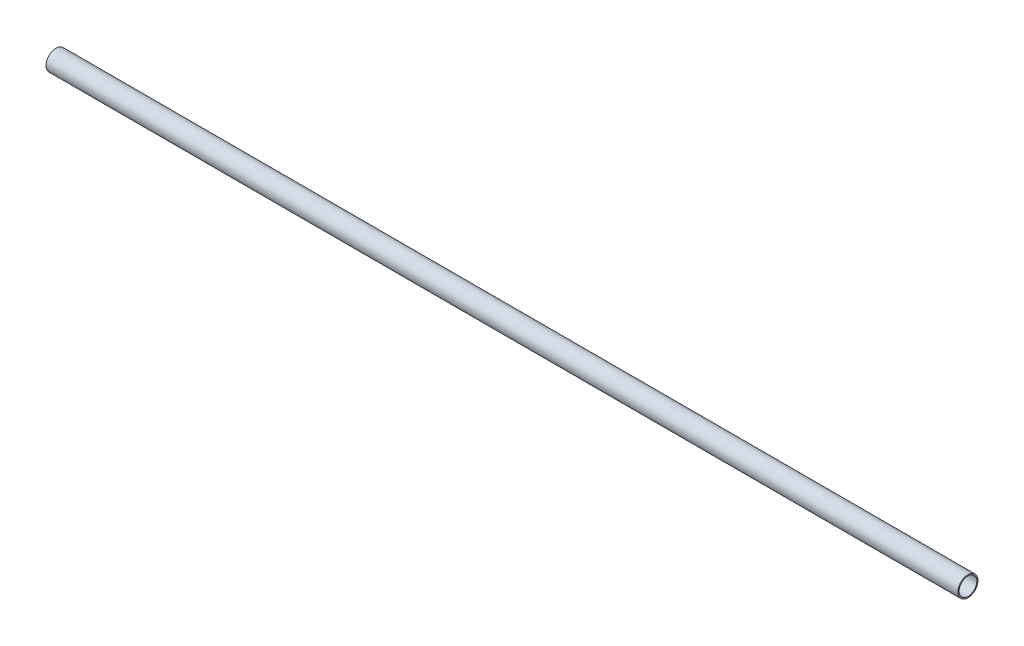
ISO-10303-21;
HEADER;
FILE_DESCRIPTION(('STEP AP214'),'2;1');
FILE_NAME('part.step','',(''),(''),'','','');
FILE_SCHEMA(('AUTOMOTIVE_DESIGN { 1 0 10303 214 1 1 1 1 }'));
ENDSEC;
DATA;
#1=APPLICATION_CONTEXT('core data for automotive mechanical design processes');
#2=APPLICATION_PROTOCOL_DEFINITION('international standard','automotive_design',2000,#1);
#3=PRODUCT_CONTEXT('',#1,'mechanical');
#4=PRODUCT('Part','Part','',(#3));
#5=PRODUCT_RELATED_PRODUCT_CATEGORY('part','',(#4));
#6=PRODUCT_DEFINITION_FORMATION('','',#4);
#7=PRODUCT_DEFINITION_CONTEXT('part definition',#1,'design');
#8=PRODUCT_DEFINITION('design','',#6,#7);
#9=PRODUCT_DEFINITION_SHAPE('','',#8);
#10=(LENGTH_UNIT() NAMED_UNIT(*) SI_UNIT(.MILLI.,.METRE.));
#11=(NAMED_UNIT(*) PLANE_ANGLE_UNIT() SI_UNIT($,.RADIAN.));
#12=(NAMED_UNIT(*) SI_UNIT($,.STERADIAN.) SOLID_ANGLE_UNIT());
#13=UNCERTAINTY_MEASURE_WITH_UNIT(LENGTH_MEASURE(1.E-05),#10,'distance_accuracy_value','');
#14=(GEOMETRIC_REPRESENTATION_CONTEXT(3) GLOBAL_UNCERTAINTY_ASSIGNED_CONTEXT((#13)) GLOBAL_UNIT_ASSIGNED_CONTEXT((#10,
#11,#12)) REPRESENTATION_CONTEXT('',''));
#15=CARTESIAN_POINT('',(0.,0.,0.));
#16=DIRECTION('',(0.,0.,1.));
#17=DIRECTION('',(1.,0.,0.));
#18=AXIS2_PLACEMENT_3D('',#15,#16,#17);
#19=CARTESIAN_POINT('',(812.8,0.,0.));
#20=DIRECTION('',(1.,0.,0.));
#21=DIRECTION('',(0.,0.,-1.));
#22=AXIS2_PLACEMENT_3D('',#19,#20,#21);
#23=PLANE('',#22);
#24=CARTESIAN_POINT('',(812.8,0.,0.));
#25=DIRECTION('',(1.,0.,0.));
#26=DIRECTION('',(0.,0.,-1.));
#27=AXIS2_PLACEMENT_3D('',#24,#25,#26);
#28=CIRCLE('',#27,8.9662);
#29=CARTESIAN_POINT('',(812.8,0.,-8.9662));
#30=VERTEX_POINT('',#29);
#31=EDGE_CURVE('E10',#30,#30,#28,.T.);
#32=ORIENTED_EDGE('',*,*,#31,.T.);
#33=EDGE_LOOP('',(#32));
#34=FACE_BOUND('',#33,.T.);
#35=CARTESIAN_POINT('',(812.8,0.,0.));
#36=DIRECTION('',(1.,0.,0.));
#37=DIRECTION('',(0.,0.,-1.));
#38=AXIS2_PLACEMENT_3D('',#35,#36,#37);
#39=CIRCLE('',#38,7.8994);
#40=CARTESIAN_POINT('',(812.8,0.,-7.8994));
#41=VERTEX_POINT('',#40);
#42=EDGE_CURVE('E42',#41,#41,#39,.T.);
#43=ORIENTED_EDGE('',*,*,#42,.F.);
#44=EDGE_LOOP('',(#43));
#45=FACE_BOUND('',#44,.T.);
#46=ADVANCED_FACE('F31',(#34,#45),#23,.T.);
#47=CARTESIAN_POINT('',(0.,0.,0.));
#48=DIRECTION('',(1.,0.,0.));
#49=DIRECTION('',(0.,0.,-1.));
#50=AXIS2_PLACEMENT_3D('',#47,#48,#49);
#51=PLANE('',#50);
#52=CARTESIAN_POINT('',(0.,0.,0.));
#53=DIRECTION('',(1.,0.,0.));
#54=DIRECTION('',(0.,0.,-1.));
#55=AXIS2_PLACEMENT_3D('',#52,#53,#54);
#56=CIRCLE('',#55,8.9662);
#57=CARTESIAN_POINT('',(0.,0.,-8.9662));
#58=VERTEX_POINT('',#57);
#59=EDGE_CURVE('E35',#58,#58,#56,.T.);
#60=ORIENTED_EDGE('',*,*,#59,.F.);
#61=EDGE_LOOP('',(#60));
#62=FACE_BOUND('',#61,.T.);
#63=CARTESIAN_POINT('',(0.,0.,0.));
#64=DIRECTION('',(1.,0.,0.));
#65=DIRECTION('',(0.,0.,-1.));
#66=AXIS2_PLACEMENT_3D('',#63,#64,#65);
#67=CIRCLE('',#66,7.8994);
#68=CARTESIAN_POINT('',(0.,0.,-7.8994));
#69=VERTEX_POINT('',#68);
#70=EDGE_CURVE('E44',#69,#69,#67,.T.);
#71=ORIENTED_EDGE('',*,*,#70,.T.);
#72=EDGE_LOOP('',(#71));
#73=FACE_BOUND('',#72,.T.);
#74=ADVANCED_FACE('F54',(#62,#73),#51,.F.);
#75=CARTESIAN_POINT('',(812.8,0.,0.));
#76=DIRECTION('',(-1.,0.,0.));
#77=DIRECTION('',(0.,0.,1.));
#78=AXIS2_PLACEMENT_3D('',#75,#76,#77);
#79=CYLINDRICAL_SURFACE('',#78,8.9662);
#80=ORIENTED_EDGE('',*,*,#31,.F.);
#81=EDGE_LOOP('',(#80));
#82=FACE_BOUND('',#81,.T.);
#83=ORIENTED_EDGE('',*,*,#59,.T.);
#84=EDGE_LOOP('',(#83));
#85=FACE_BOUND('',#84,.T.);
#86=ADVANCED_FACE('F33',(#82,#85),#79,.T.);
#87=CARTESIAN_POINT('',(812.8,0.,0.));
#88=DIRECTION('',(-1.,0.,0.));
#89=DIRECTION('',(0.,0.,1.));
#90=AXIS2_PLACEMENT_3D('',#87,#88,#89);
#91=CYLINDRICAL_SURFACE('',#90,7.8994);
#92=ORIENTED_EDGE('',*,*,#42,.T.);
#93=EDGE_LOOP('',(#92));
#94=FACE_BOUND('',#93,.T.);
#95=ORIENTED_EDGE('',*,*,#70,.F.);
#96=EDGE_LOOP('',(#95));
#97=FACE_BOUND('',#96,.T.);
#98=ADVANCED_FACE('F50',(#94,#97),#91,.F.);
#99=CLOSED_SHELL('',(#46,#74,#86,#98));
#100=MANIFOLD_SOLID_BREP('B2',#99);
#101=ADVANCED_BREP_SHAPE_REPRESENTATION('',(#18,#100),#14);
#102=SHAPE_DEFINITION_REPRESENTATION(#9,#101);
ENDSEC;
END-ISO-10303-21;
